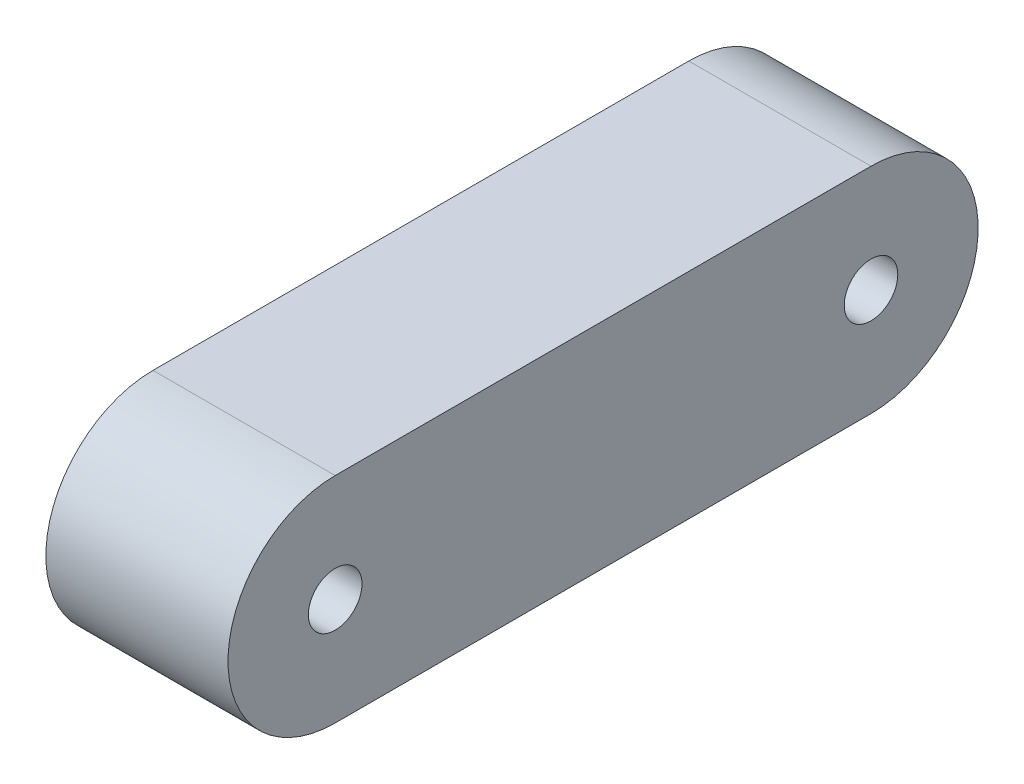
ISO-10303-21;
HEADER;
FILE_DESCRIPTION(('STEP AP214'),'2;1');
FILE_NAME('part.step','',(''),(''),'','','');
FILE_SCHEMA(('AUTOMOTIVE_DESIGN { 1 0 10303 214 1 1 1 1 }'));
ENDSEC;
DATA;
#1=APPLICATION_CONTEXT('core data for automotive mechanical design processes');
#2=APPLICATION_PROTOCOL_DEFINITION('international standard','automotive_design',2000,#1);
#3=PRODUCT_CONTEXT('',#1,'mechanical');
#4=PRODUCT('Part','Part','',(#3));
#5=PRODUCT_RELATED_PRODUCT_CATEGORY('part','',(#4));
#6=PRODUCT_DEFINITION_FORMATION('','',#4);
#7=PRODUCT_DEFINITION_CONTEXT('part definition',#1,'design');
#8=PRODUCT_DEFINITION('design','',#6,#7);
#9=PRODUCT_DEFINITION_SHAPE('','',#8);
#10=(LENGTH_UNIT() NAMED_UNIT(*) SI_UNIT(.MILLI.,.METRE.));
#11=(NAMED_UNIT(*) PLANE_ANGLE_UNIT() SI_UNIT($,.RADIAN.));
#12=(NAMED_UNIT(*) SI_UNIT($,.STERADIAN.) SOLID_ANGLE_UNIT());
#13=UNCERTAINTY_MEASURE_WITH_UNIT(LENGTH_MEASURE(1.E-05),#10,'distance_accuracy_value','');
#14=(GEOMETRIC_REPRESENTATION_CONTEXT(3) GLOBAL_UNCERTAINTY_ASSIGNED_CONTEXT((#13)) GLOBAL_UNIT_ASSIGNED_CONTEXT((#10,
#11,#12)) REPRESENTATION_CONTEXT('',''));
#15=CARTESIAN_POINT('',(0.,0.,0.));
#16=DIRECTION('',(0.,0.,1.));
#17=DIRECTION('',(1.,0.,0.));
#18=AXIS2_PLACEMENT_3D('',#15,#16,#17);
#19=CARTESIAN_POINT('',(8.5,0.,25.));
#20=DIRECTION('',(1.,0.,0.));
#21=DIRECTION('',(0.,0.,-1.));
#22=AXIS2_PLACEMENT_3D('',#19,#20,#21);
#23=PLANE('',#22);
#24=CARTESIAN_POINT('',(8.5,0.,25.));
#25=DIRECTION('',(1.,0.,0.));
#26=DIRECTION('',(0.,0.,-1.));
#27=AXIS2_PLACEMENT_3D('',#24,#25,#26);
#28=CIRCLE('',#27,2.5);
#29=CARTESIAN_POINT('',(8.5,0.,22.5));
#30=VERTEX_POINT('',#29);
#31=EDGE_CURVE('E100',#30,#30,#28,.T.);
#32=ORIENTED_EDGE('',*,*,#31,.F.);
#33=EDGE_LOOP('',(#32));
#34=FACE_BOUND('',#33,.T.);
#35=CARTESIAN_POINT('',(8.5,0.,25.));
#36=DIRECTION('',(1.,0.,0.));
#37=DIRECTION('',(0.,0.,-1.));
#38=AXIS2_PLACEMENT_3D('',#35,#36,#37);
#39=CIRCLE('',#38,9.99999999999998);
#40=CARTESIAN_POINT('',(8.5,9.99999999999997,25.));
#41=VERTEX_POINT('',#40);
#42=CARTESIAN_POINT('',(8.5,-9.99999999999999,25.));
#43=VERTEX_POINT('',#42);
#44=EDGE_CURVE('E85',#41,#43,#39,.T.);
#45=ORIENTED_EDGE('',*,*,#44,.T.);
#46=DIRECTION('',(0.,0.,-1.));
#47=VECTOR('',#46,1.);
#48=CARTESIAN_POINT('',(8.5,-9.99999999999999,25.));
#49=LINE('',#48,#47);
#50=CARTESIAN_POINT('',(8.5,-9.99999999999997,-25.));
#51=VERTEX_POINT('',#50);
#52=EDGE_CURVE('E80',#43,#51,#49,.T.);
#53=ORIENTED_EDGE('',*,*,#52,.T.);
#54=CARTESIAN_POINT('',(8.5,0.,-25.));
#55=DIRECTION('',(1.,0.,0.));
#56=DIRECTION('',(0.,0.,-1.));
#57=AXIS2_PLACEMENT_3D('',#54,#55,#56);
#58=CIRCLE('',#57,9.99999999999998);
#59=CARTESIAN_POINT('',(8.5,9.99999999999998,-25.));
#60=VERTEX_POINT('',#59);
#61=EDGE_CURVE('E83',#51,#60,#58,.T.);
#62=ORIENTED_EDGE('',*,*,#61,.T.);
#63=DIRECTION('',(0.,0.,1.));
#64=VECTOR('',#63,1.);
#65=CARTESIAN_POINT('',(8.5,9.99999999999997,25.));
#66=LINE('',#65,#64);
#67=EDGE_CURVE('E50',#60,#41,#66,.T.);
#68=ORIENTED_EDGE('',*,*,#67,.T.);
#69=EDGE_LOOP('',(#45,#53,#62,#68));
#70=FACE_BOUND('',#69,.T.);
#71=CARTESIAN_POINT('',(8.5,0.,-25.));
#72=DIRECTION('',(1.,0.,0.));
#73=DIRECTION('',(0.,0.,-1.));
#74=AXIS2_PLACEMENT_3D('',#71,#72,#73);
#75=CIRCLE('',#74,2.5);
#76=CARTESIAN_POINT('',(8.5,0.,-27.5));
#77=VERTEX_POINT('',#76);
#78=EDGE_CURVE('E115',#77,#77,#75,.T.);
#79=ORIENTED_EDGE('',*,*,#78,.F.);
#80=EDGE_LOOP('',(#79));
#81=FACE_BOUND('',#80,.T.);
#82=ADVANCED_FACE('F33',(#34,#70,#81),#23,.T.);
#83=CARTESIAN_POINT('',(-8.5,0.,25.));
#84=DIRECTION('',(1.,0.,0.));
#85=DIRECTION('',(0.,0.,-1.));
#86=AXIS2_PLACEMENT_3D('',#83,#84,#85);
#87=PLANE('',#86);
#88=CARTESIAN_POINT('',(-8.5,0.,25.));
#89=DIRECTION('',(1.,0.,0.));
#90=DIRECTION('',(0.,0.,-1.));
#91=AXIS2_PLACEMENT_3D('',#88,#89,#90);
#92=CIRCLE('',#91,9.99999999999998);
#93=CARTESIAN_POINT('',(-8.5,9.99999999999997,25.));
#94=VERTEX_POINT('',#93);
#95=CARTESIAN_POINT('',(-8.5,-9.99999999999999,25.));
#96=VERTEX_POINT('',#95);
#97=EDGE_CURVE('E97',#94,#96,#92,.T.);
#98=ORIENTED_EDGE('',*,*,#97,.F.);
#99=DIRECTION('',(0.,0.,1.));
#100=VECTOR('',#99,1.);
#101=CARTESIAN_POINT('',(-8.5,9.99999999999997,25.));
#102=LINE('',#101,#100);
#103=CARTESIAN_POINT('',(-8.5,9.99999999999998,-25.));
#104=VERTEX_POINT('',#103);
#105=EDGE_CURVE('E73',#104,#94,#102,.T.);
#106=ORIENTED_EDGE('',*,*,#105,.F.);
#107=CARTESIAN_POINT('',(-8.5,0.,-25.));
#108=DIRECTION('',(1.,0.,0.));
#109=DIRECTION('',(0.,0.,-1.));
#110=AXIS2_PLACEMENT_3D('',#107,#108,#109);
#111=CIRCLE('',#110,9.99999999999998);
#112=CARTESIAN_POINT('',(-8.5,-9.99999999999997,-25.));
#113=VERTEX_POINT('',#112);
#114=EDGE_CURVE('E67',#113,#104,#111,.T.);
#115=ORIENTED_EDGE('',*,*,#114,.F.);
#116=DIRECTION('',(0.,0.,-1.));
#117=VECTOR('',#116,1.);
#118=CARTESIAN_POINT('',(-8.5,-9.99999999999999,25.));
#119=LINE('',#118,#117);
#120=EDGE_CURVE('E89',#96,#113,#119,.T.);
#121=ORIENTED_EDGE('',*,*,#120,.F.);
#122=EDGE_LOOP('',(#98,#106,#115,#121));
#123=FACE_BOUND('',#122,.T.);
#124=CARTESIAN_POINT('',(-8.5,0.,25.));
#125=DIRECTION('',(1.,0.,0.));
#126=DIRECTION('',(0.,0.,-1.));
#127=AXIS2_PLACEMENT_3D('',#124,#125,#126);
#128=CIRCLE('',#127,2.5);
#129=CARTESIAN_POINT('',(-8.5,0.,22.5));
#130=VERTEX_POINT('',#129);
#131=EDGE_CURVE('E112',#130,#130,#128,.T.);
#132=ORIENTED_EDGE('',*,*,#131,.T.);
#133=EDGE_LOOP('',(#132));
#134=FACE_BOUND('',#133,.T.);
#135=CARTESIAN_POINT('',(-8.5,0.,-25.));
#136=DIRECTION('',(1.,0.,0.));
#137=DIRECTION('',(0.,0.,-1.));
#138=AXIS2_PLACEMENT_3D('',#135,#136,#137);
#139=CIRCLE('',#138,2.5);
#140=CARTESIAN_POINT('',(-8.5,0.,-27.5));
#141=VERTEX_POINT('',#140);
#142=EDGE_CURVE('E118',#141,#141,#139,.T.);
#143=ORIENTED_EDGE('',*,*,#142,.T.);
#144=EDGE_LOOP('',(#143));
#145=FACE_BOUND('',#144,.T.);
#146=ADVANCED_FACE('F108',(#123,#134,#145),#87,.F.);
#147=CARTESIAN_POINT('',(8.5,0.,25.));
#148=DIRECTION('',(-1.,0.,0.));
#149=DIRECTION('',(0.,0.,1.));
#150=AXIS2_PLACEMENT_3D('',#147,#148,#149);
#151=CYLINDRICAL_SURFACE('',#150,9.99999999999998);
#152=ORIENTED_EDGE('',*,*,#97,.T.);
#153=DIRECTION('',(-1.,0.,0.));
#154=VECTOR('',#153,1.);
#155=CARTESIAN_POINT('',(8.5,-9.99999999999999,25.));
#156=LINE('',#155,#154);
#157=EDGE_CURVE('E11',#43,#96,#156,.T.);
#158=ORIENTED_EDGE('',*,*,#157,.F.);
#159=ORIENTED_EDGE('',*,*,#44,.F.);
#160=DIRECTION('',(-1.,0.,0.));
#161=VECTOR('',#160,1.);
#162=CARTESIAN_POINT('',(8.5,9.99999999999997,25.));
#163=LINE('',#162,#161);
#164=EDGE_CURVE('E93',#41,#94,#163,.T.);
#165=ORIENTED_EDGE('',*,*,#164,.T.);
#166=EDGE_LOOP('',(#152,#158,#159,#165));
#167=FACE_BOUND('',#166,.T.);
#168=ADVANCED_FACE('F35',(#167),#151,.T.);
#169=CARTESIAN_POINT('',(8.5,-9.99999999999999,25.));
#170=DIRECTION('',(0.,1.,0.));
#171=DIRECTION('',(0.,0.,1.));
#172=AXIS2_PLACEMENT_3D('',#169,#170,#171);
#173=PLANE('',#172);
#174=ORIENTED_EDGE('',*,*,#120,.T.);
#175=DIRECTION('',(-1.,0.,0.));
#176=VECTOR('',#175,1.);
#177=CARTESIAN_POINT('',(8.5,-9.99999999999997,-25.));
#178=LINE('',#177,#176);
#179=EDGE_CURVE('E42',#51,#113,#178,.T.);
#180=ORIENTED_EDGE('',*,*,#179,.F.);
#181=ORIENTED_EDGE('',*,*,#52,.F.);
#182=ORIENTED_EDGE('',*,*,#157,.T.);
#183=EDGE_LOOP('',(#174,#180,#181,#182));
#184=FACE_BOUND('',#183,.T.);
#185=ADVANCED_FACE('F88',(#184),#173,.F.);
#186=CARTESIAN_POINT('',(8.5,0.,-25.));
#187=DIRECTION('',(-1.,0.,0.));
#188=DIRECTION('',(0.,0.,1.));
#189=AXIS2_PLACEMENT_3D('',#186,#187,#188);
#190=CYLINDRICAL_SURFACE('',#189,9.99999999999998);
#191=ORIENTED_EDGE('',*,*,#114,.T.);
#192=DIRECTION('',(-1.,0.,0.));
#193=VECTOR('',#192,1.);
#194=CARTESIAN_POINT('',(8.5,9.99999999999998,-25.));
#195=LINE('',#194,#193);
#196=EDGE_CURVE('E90',#60,#104,#195,.T.);
#197=ORIENTED_EDGE('',*,*,#196,.F.);
#198=ORIENTED_EDGE('',*,*,#61,.F.);
#199=ORIENTED_EDGE('',*,*,#179,.T.);
#200=EDGE_LOOP('',(#191,#197,#198,#199));
#201=FACE_BOUND('',#200,.T.);
#202=ADVANCED_FACE('F91',(#201),#190,.T.);
#203=CARTESIAN_POINT('',(8.5,9.99999999999997,25.));
#204=DIRECTION('',(0.,-1.,0.));
#205=DIRECTION('',(0.,0.,-1.));
#206=AXIS2_PLACEMENT_3D('',#203,#204,#205);
#207=PLANE('',#206);
#208=ORIENTED_EDGE('',*,*,#105,.T.);
#209=ORIENTED_EDGE('',*,*,#164,.F.);
#210=ORIENTED_EDGE('',*,*,#67,.F.);
#211=ORIENTED_EDGE('',*,*,#196,.T.);
#212=EDGE_LOOP('',(#208,#209,#210,#211));
#213=FACE_BOUND('',#212,.T.);
#214=ADVANCED_FACE('F105',(#213),#207,.F.);
#215=CARTESIAN_POINT('',(8.5,0.,25.));
#216=DIRECTION('',(-1.,0.,0.));
#217=DIRECTION('',(0.,0.,1.));
#218=AXIS2_PLACEMENT_3D('',#215,#216,#217);
#219=CYLINDRICAL_SURFACE('',#218,2.5);
#220=ORIENTED_EDGE('',*,*,#31,.T.);
#221=EDGE_LOOP('',(#220));
#222=FACE_BOUND('',#221,.T.);
#223=ORIENTED_EDGE('',*,*,#131,.F.);
#224=EDGE_LOOP('',(#223));
#225=FACE_BOUND('',#224,.T.);
#226=ADVANCED_FACE('F135',(#222,#225),#219,.F.);
#227=CARTESIAN_POINT('',(8.5,0.,-25.));
#228=DIRECTION('',(-1.,0.,0.));
#229=DIRECTION('',(0.,0.,1.));
#230=AXIS2_PLACEMENT_3D('',#227,#228,#229);
#231=CYLINDRICAL_SURFACE('',#230,2.5);
#232=ORIENTED_EDGE('',*,*,#78,.T.);
#233=EDGE_LOOP('',(#232));
#234=FACE_BOUND('',#233,.T.);
#235=ORIENTED_EDGE('',*,*,#142,.F.);
#236=EDGE_LOOP('',(#235));
#237=FACE_BOUND('',#236,.T.);
#238=ADVANCED_FACE('F124',(#234,#237),#231,.F.);
#239=CLOSED_SHELL('',(#82,#146,#168,#185,#202,#214,#226,#238));
#240=MANIFOLD_SOLID_BREP('B2',#239);
#241=ADVANCED_BREP_SHAPE_REPRESENTATION('',(#18,#240),#14);
#242=SHAPE_DEFINITION_REPRESENTATION(#9,#241);
ENDSEC;
END-ISO-10303-21;
